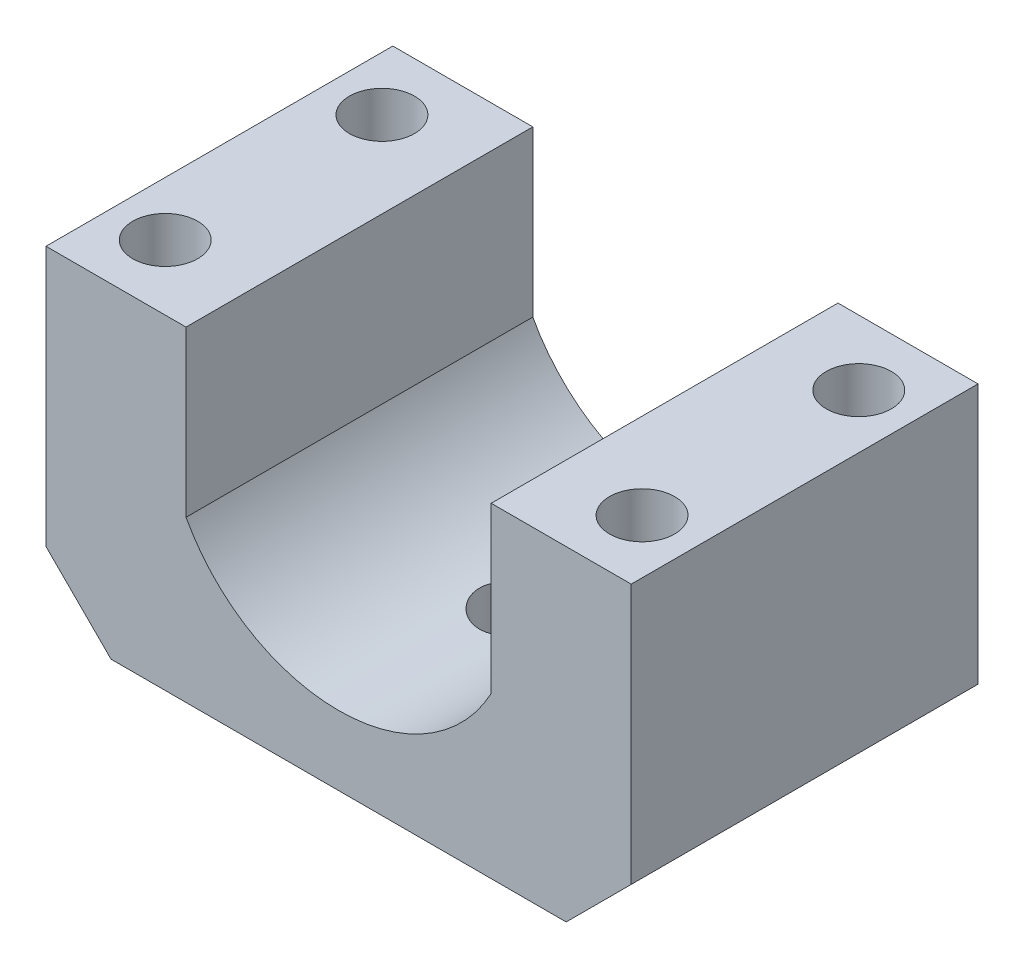
ISO-10303-21;
HEADER;
FILE_DESCRIPTION(('STEP AP214'),'2;1');
FILE_NAME('part.step','',(''),(''),'','','');
FILE_SCHEMA(('AUTOMOTIVE_DESIGN { 1 0 10303 214 1 1 1 1 }'));
ENDSEC;
DATA;
#1=APPLICATION_CONTEXT('core data for automotive mechanical design processes');
#2=APPLICATION_PROTOCOL_DEFINITION('international standard','automotive_design',2000,#1);
#3=PRODUCT_CONTEXT('',#1,'mechanical');
#4=PRODUCT('Part','Part','',(#3));
#5=PRODUCT_RELATED_PRODUCT_CATEGORY('part','',(#4));
#6=PRODUCT_DEFINITION_FORMATION('','',#4);
#7=PRODUCT_DEFINITION_CONTEXT('part definition',#1,'design');
#8=PRODUCT_DEFINITION('design','',#6,#7);
#9=PRODUCT_DEFINITION_SHAPE('','',#8);
#10=(LENGTH_UNIT() NAMED_UNIT(*) SI_UNIT(.MILLI.,.METRE.));
#11=(NAMED_UNIT(*) PLANE_ANGLE_UNIT() SI_UNIT($,.RADIAN.));
#12=(NAMED_UNIT(*) SI_UNIT($,.STERADIAN.) SOLID_ANGLE_UNIT());
#13=UNCERTAINTY_MEASURE_WITH_UNIT(LENGTH_MEASURE(1.E-05),#10,'distance_accuracy_value','');
#14=(GEOMETRIC_REPRESENTATION_CONTEXT(3) GLOBAL_UNCERTAINTY_ASSIGNED_CONTEXT((#13)) GLOBAL_UNIT_ASSIGNED_CONTEXT((#10,
#11,#12)) REPRESENTATION_CONTEXT('',''));
#15=CARTESIAN_POINT('',(0.,0.,0.));
#16=DIRECTION('',(0.,0.,1.));
#17=DIRECTION('',(1.,0.,0.));
#18=AXIS2_PLACEMENT_3D('',#15,#16,#17);
#19=CARTESIAN_POINT('',(0.,0.,16.));
#20=DIRECTION('',(0.,0.,-1.));
#21=DIRECTION('',(-1.,0.,0.));
#22=AXIS2_PLACEMENT_3D('',#19,#20,#21);
#23=CYLINDRICAL_SURFACE('',#22,8.);
#24=DIRECTION('',(0.,0.,-1.));
#25=VECTOR('',#24,1.);
#26=CARTESIAN_POINT('',(-7.03988636271922,-3.8,16.));
#27=LINE('',#26,#25);
#28=CARTESIAN_POINT('',(-7.03988636271922,-3.8,16.));
#29=VERTEX_POINT('',#28);
#30=CARTESIAN_POINT('',(-7.03988636271922,-3.8,0.));
#31=VERTEX_POINT('',#30);
#32=EDGE_CURVE('E118',#29,#31,#27,.T.);
#33=ORIENTED_EDGE('',*,*,#32,.F.);
#34=CARTESIAN_POINT('',(0.,0.,16.));
#35=DIRECTION('',(0.,0.,-1.));
#36=DIRECTION('',(-1.,0.,0.));
#37=AXIS2_PLACEMENT_3D('',#34,#35,#36);
#38=CIRCLE('',#37,8.);
#39=CARTESIAN_POINT('',(7.03988636271922,-3.8,16.));
#40=VERTEX_POINT('',#39);
#41=EDGE_CURVE('E148',#40,#29,#38,.T.);
#42=ORIENTED_EDGE('',*,*,#41,.F.);
#43=DIRECTION('',(0.,0.,-1.));
#44=VECTOR('',#43,1.);
#45=CARTESIAN_POINT('',(7.03988636271922,-3.8,16.));
#46=LINE('',#45,#44);
#47=CARTESIAN_POINT('',(7.03988636271922,-3.8,0.));
#48=VERTEX_POINT('',#47);
#49=EDGE_CURVE('E80',#40,#48,#46,.T.);
#50=ORIENTED_EDGE('',*,*,#49,.T.);
#51=CARTESIAN_POINT('',(0.,0.,0.));
#52=DIRECTION('',(0.,0.,-1.));
#53=DIRECTION('',(-1.,0.,0.));
#54=AXIS2_PLACEMENT_3D('',#51,#52,#53);
#55=CIRCLE('',#54,8.);
#56=EDGE_CURVE('E127',#48,#31,#55,.T.);
#57=ORIENTED_EDGE('',*,*,#56,.T.);
#58=EDGE_LOOP('',(#33,#42,#50,#57));
#59=FACE_BOUND('',#58,.T.);
#60=CARTESIAN_POINT('',(0.,-8.,6.5));
#61=CARTESIAN_POINT('',(0.0833868537930099,-7.99999819477373,6.50000393821342));
#62=CARTESIAN_POINT('',(0.166878352185804,-7.99868157582362,6.50698311729056));
#63=CARTESIAN_POINT('',(0.331573874094402,-7.993552335781,6.5347157734866));
#64=CARTESIAN_POINT('',(0.412772985279594,-7.98973472470621,6.55549678919107));
#65=CARTESIAN_POINT('',(0.570380918902888,-7.98003072170383,6.61017640810877));
#66=CARTESIAN_POINT('',(0.646796039965722,-7.9741471203648,6.6440573231462));
#67=CARTESIAN_POINT('',(0.79282725037137,-7.96095516283942,6.72393113039572));
#68=CARTESIAN_POINT('',(0.86244568924562,-7.95364730163886,6.7699198166283));
#69=CARTESIAN_POINT('',(0.99378177334355,-7.93831356691209,6.87329839444127));
#70=CARTESIAN_POINT('',(1.05540565080139,-7.93028077226027,6.93080640769828));
#71=CARTESIAN_POINT('',(1.16819341503162,-7.91445359605847,7.05533977569488));
#72=CARTESIAN_POINT('',(1.21935599974279,-7.90665924428876,7.12236631339722));
#73=CARTESIAN_POINT('',(1.3101501698913,-7.89212548078817,7.26468639693758));
#74=CARTESIAN_POINT('',(1.34968755533201,-7.88539488113185,7.34004101763045));
#75=CARTESIAN_POINT('',(1.41550547234587,-7.873847090732,7.49646960983975));
#76=CARTESIAN_POINT('',(1.44178726041775,-7.86902971864274,7.57754303843936));
#77=CARTESIAN_POINT('',(1.48005051894972,-7.86192269859203,7.74211516557808));
#78=CARTESIAN_POINT('',(1.49219388286487,-7.85960445732956,7.82557496436828));
#79=CARTESIAN_POINT('',(1.50233808388958,-7.85767197097443,7.99337725104135));
#80=CARTESIAN_POINT('',(1.50034016686744,-7.85805748767657,8.07771966051116));
#81=CARTESIAN_POINT('',(1.48238983259424,-7.86146292034107,8.24371920167856));
#82=CARTESIAN_POINT('',(1.4666216298026,-7.86444805794284,8.32539707226822));
#83=CARTESIAN_POINT('',(1.42186821628764,-7.87266179166918,8.48492780648444));
#84=CARTESIAN_POINT('',(1.39288234029825,-7.87789050071542,8.56278047736423));
#85=CARTESIAN_POINT('',(1.32233516521821,-7.89003878202028,8.71299150636864));
#86=CARTESIAN_POINT('',(1.28069908838472,-7.89696836031569,8.78531390199751));
#87=CARTESIAN_POINT('',(1.18608961629417,-7.91173030510972,8.92200958420064));
#88=CARTESIAN_POINT('',(1.1331159203364,-7.91956269555053,8.98638265986856));
#89=CARTESIAN_POINT('',(1.01635208508941,-7.93539829134603,9.10641187448002));
#90=CARTESIAN_POINT('',(0.952406289044373,-7.94340225682906,9.16191658346096));
#91=CARTESIAN_POINT('',(0.815998209498492,-7.95857075037328,9.26145823877834));
#92=CARTESIAN_POINT('',(0.743532180140778,-7.96573490643359,9.30549011360342));
#93=CARTESIAN_POINT('',(0.591963187313074,-7.97843180568726,9.38085539100454));
#94=CARTESIAN_POINT('',(0.512847006138679,-7.98396119623876,9.41216274620421));
#95=CARTESIAN_POINT('',(0.350454372941183,-7.99273154230783,9.46093850773641));
#96=CARTESIAN_POINT('',(0.267187064116381,-7.99597730825371,9.47843601388517));
#97=CARTESIAN_POINT('',(0.152748431645325,-7.99859995806791,9.49251759126554));
#98=CARTESIAN_POINT('',(0.122272622321126,-7.99912381977634,9.49532114545617));
#99=CARTESIAN_POINT('',(0.0612025752280015,-7.99982417226057,9.49906307369213));
#100=CARTESIAN_POINT('',(0.0306083373219764,-8.00000066263412,9.50000144557756));
#101=CARTESIAN_POINT('',(-0.0833868537930071,-7.99999819477373,9.49999606178658));
#102=CARTESIAN_POINT('',(-0.166878352185801,-7.99868157582362,9.49301688270944));
#103=CARTESIAN_POINT('',(-0.331573874094399,-7.993552335781,9.4652842265134));
#104=CARTESIAN_POINT('',(-0.412772985279592,-7.98973472470621,9.44450321080893));
#105=CARTESIAN_POINT('',(-0.570380918902886,-7.98003072170383,9.38982359189123));
#106=CARTESIAN_POINT('',(-0.646796039965719,-7.9741471203648,9.3559426768538));
#107=CARTESIAN_POINT('',(-0.792827250371368,-7.96095516283942,9.27606886960428));
#108=CARTESIAN_POINT('',(-0.862445689245618,-7.95364730163886,9.2300801833717));
#109=CARTESIAN_POINT('',(-0.993781773343547,-7.93831356691209,9.12670160555873));
#110=CARTESIAN_POINT('',(-1.05540565080139,-7.93028077226027,9.06919359230172));
#111=CARTESIAN_POINT('',(-1.16819341503162,-7.91445359605848,8.94466022430512));
#112=CARTESIAN_POINT('',(-1.21935599974279,-7.90665924428876,8.87763368660278));
#113=CARTESIAN_POINT('',(-1.3101501698913,-7.89212548078817,8.73531360306242));
#114=CARTESIAN_POINT('',(-1.34968755533201,-7.88539488113186,8.65995898236955));
#115=CARTESIAN_POINT('',(-1.41550547234587,-7.87384709073201,8.50353039016025));
#116=CARTESIAN_POINT('',(-1.44178726041775,-7.86902971864274,8.42245696156064));
#117=CARTESIAN_POINT('',(-1.48005051894971,-7.86192269859203,8.25788483442192));
#118=CARTESIAN_POINT('',(-1.49219388286486,-7.85960445732956,8.17442503563172));
#119=CARTESIAN_POINT('',(-1.50233808388958,-7.85767197097443,8.00662274895865));
#120=CARTESIAN_POINT('',(-1.50034016686743,-7.85805748767657,7.92228033948884));
#121=CARTESIAN_POINT('',(-1.48238983259424,-7.86146292034107,7.75628079832144));
#122=CARTESIAN_POINT('',(-1.4666216298026,-7.86444805794284,7.67460292773178));
#123=CARTESIAN_POINT('',(-1.42186821628764,-7.87266179166918,7.51507219351557));
#124=CARTESIAN_POINT('',(-1.39288234029825,-7.87789050071542,7.43721952263578));
#125=CARTESIAN_POINT('',(-1.32233516521821,-7.89003878202028,7.28700849363136));
#126=CARTESIAN_POINT('',(-1.28069908838472,-7.89696836031569,7.21468609800249));
#127=CARTESIAN_POINT('',(-1.18608961629416,-7.91173030510972,7.07799041579936));
#128=CARTESIAN_POINT('',(-1.1331159203364,-7.91956269555054,7.01361734013144));
#129=CARTESIAN_POINT('',(-1.01635208508941,-7.93539829134603,6.89358812551998));
#130=CARTESIAN_POINT('',(-0.95240628904437,-7.94340225682906,6.83808341653904));
#131=CARTESIAN_POINT('',(-0.81599820949849,-7.95857075037328,6.73854176122166));
#132=CARTESIAN_POINT('',(-0.743532180140776,-7.96573490643359,6.69450988639658));
#133=CARTESIAN_POINT('',(-0.591963187313073,-7.97843180568726,6.61914460899547));
#134=CARTESIAN_POINT('',(-0.512847006138678,-7.98396119623876,6.58783725379579));
#135=CARTESIAN_POINT('',(-0.350454372941182,-7.99273154230783,6.53906149226359));
#136=CARTESIAN_POINT('',(-0.26718706411638,-7.99597730825371,6.52156398611483));
#137=CARTESIAN_POINT('',(-0.152748431645324,-7.99859995806791,6.50748240873446));
#138=CARTESIAN_POINT('',(-0.122272622321125,-7.99912381977634,6.50467885454384));
#139=CARTESIAN_POINT('',(-0.0612025752280001,-7.99982417226057,6.50093692630787));
#140=CARTESIAN_POINT('',(-0.0306083373219742,-8.00000066263412,6.49999855442244));
#141=CARTESIAN_POINT('',(0.,-8.,6.5));
#142=B_SPLINE_CURVE_WITH_KNOTS('',3,(#60,#61,#62,#63,#64,#65,#66,#67,#68,#69,#70,#71,#72,#73,
#74,#75,#76,#77,#78,#79,#80,#81,#82,#83,#84,#85,#86,#87,#88,#89,#90,#91,#92,#93,#94,#95,#96,#97,
#98,#99,#100,#101,#102,#103,#104,#105,#106,#107,#108,#109,#110,#111,#112,#113,#114,#115,#116,
#117,#118,#119,#120,#121,#122,#123,#124,#125,#126,#127,#128,#129,#130,#131,#132,#133,#134,#135,
#136,#137,#138,#139,#140,#141),.UNSPECIFIED.,.T.,.F.,(4,2,2,2,2,2,2,2,2,2,2,2,2,2,2,2,2,2,2,2,2,
2,2,2,2,2,2,2,2,2,2,2,2,2,2,2,2,2,2,2,4),(0.,0.250043615860785,0.500587644663305,
0.750794550490422,1.00091465423448,1.25374453431369,1.50660586364784,1.76146299504457,
2.0162959639786,2.26818131595642,2.52004447672905,2.76858903253727,3.01714609936091,
3.26720200380497,3.51726454115,3.77122292222619,4.02529337465931,4.27988132685465,
4.53393137376114,4.62571335291781,4.71749543835866,4.96753905421944,5.21808308302196,
5.46828998884908,5.71841009259314,5.97123997267235,6.22410130200649,6.47895843340322,
6.73379140233725,6.98567675431508,7.23753991508771,7.48608447089592,7.73464153771956,
7.98469744216363,8.23475997950866,8.48871836058484,8.74278881301796,8.9973767652133,
9.2514268121198,9.34320879127646,9.43499087671731),.UNSPECIFIED.);
#143=CARTESIAN_POINT('',(0.,-8.,6.5));
#144=VERTEX_POINT('',#143);
#145=EDGE_CURVE('E21',#144,#144,#142,.T.);
#146=ORIENTED_EDGE('',*,*,#145,.T.);
#147=EDGE_LOOP('',(#146));
#148=FACE_BOUND('',#147,.T.);
#149=ADVANCED_FACE('F17',(#59,#148),#23,.F.);
#150=CARTESIAN_POINT('',(-7.03988636271922,0.,16.));
#151=DIRECTION('',(1.,0.,0.));
#152=DIRECTION('',(0.,0.,-1.));
#153=AXIS2_PLACEMENT_3D('',#150,#151,#152);
#154=PLANE('',#153);
#155=DIRECTION('',(0.,1.,0.));
#156=VECTOR('',#155,1.);
#157=CARTESIAN_POINT('',(-7.03988636271922,0.,16.));
#158=LINE('',#157,#156);
#159=CARTESIAN_POINT('',(-7.03988636271922,3.8,16.));
#160=VERTEX_POINT('',#159);
#161=EDGE_CURVE('E123',#29,#160,#158,.T.);
#162=ORIENTED_EDGE('',*,*,#161,.F.);
#163=ORIENTED_EDGE('',*,*,#32,.T.);
#164=DIRECTION('',(0.,1.,0.));
#165=VECTOR('',#164,1.);
#166=CARTESIAN_POINT('',(-7.03988636271922,0.,0.));
#167=LINE('',#166,#165);
#168=CARTESIAN_POINT('',(-7.03988636271922,3.8,0.));
#169=VERTEX_POINT('',#168);
#170=EDGE_CURVE('E121',#31,#169,#167,.T.);
#171=ORIENTED_EDGE('',*,*,#170,.T.);
#172=DIRECTION('',(0.,0.,1.));
#173=VECTOR('',#172,1.);
#174=CARTESIAN_POINT('',(-7.03988636271922,3.8,16.));
#175=LINE('',#174,#173);
#176=EDGE_CURVE('E111',#160,#169,#175,.F.);
#177=ORIENTED_EDGE('',*,*,#176,.F.);
#178=EDGE_LOOP('',(#162,#163,#171,#177));
#179=FACE_BOUND('',#178,.T.);
#180=ADVANCED_FACE('F120',(#179),#154,.T.);
#181=CARTESIAN_POINT('',(0.,3.8,16.));
#182=DIRECTION('',(0.,1.,0.));
#183=DIRECTION('',(0.,0.,1.));
#184=AXIS2_PLACEMENT_3D('',#181,#182,#183);
#185=PLANE('',#184);
#186=DIRECTION('',(1.,0.,0.));
#187=VECTOR('',#186,1.);
#188=CARTESIAN_POINT('',(0.,3.8,16.));
#189=LINE('',#188,#187);
#190=CARTESIAN_POINT('',(-13.5,3.8,16.));
#191=VERTEX_POINT('',#190);
#192=EDGE_CURVE('E198',#160,#191,#189,.F.);
#193=ORIENTED_EDGE('',*,*,#192,.F.);
#194=ORIENTED_EDGE('',*,*,#176,.T.);
#195=DIRECTION('',(1.,0.,0.));
#196=VECTOR('',#195,1.);
#197=CARTESIAN_POINT('',(0.,3.8,0.));
#198=LINE('',#197,#196);
#199=CARTESIAN_POINT('',(-13.5,3.8,0.));
#200=VERTEX_POINT('',#199);
#201=EDGE_CURVE('E129',#169,#200,#198,.F.);
#202=ORIENTED_EDGE('',*,*,#201,.T.);
#203=DIRECTION('',(0.,0.,1.));
#204=VECTOR('',#203,1.);
#205=CARTESIAN_POINT('',(-13.5,3.8,16.));
#206=LINE('',#205,#204);
#207=EDGE_CURVE('E195',#191,#200,#206,.F.);
#208=ORIENTED_EDGE('',*,*,#207,.F.);
#209=EDGE_LOOP('',(#193,#194,#202,#208));
#210=FACE_BOUND('',#209,.T.);
#211=CARTESIAN_POINT('',(-11.,3.8,3.));
#212=DIRECTION('',(0.,1.,0.));
#213=DIRECTION('',(0.,0.,1.));
#214=AXIS2_PLACEMENT_3D('',#211,#212,#213);
#215=CIRCLE('',#214,1.5);
#216=CARTESIAN_POINT('',(-11.,3.8,4.5));
#217=VERTEX_POINT('',#216);
#218=EDGE_CURVE('E132',#217,#217,#215,.F.);
#219=ORIENTED_EDGE('',*,*,#218,.T.);
#220=EDGE_LOOP('',(#219));
#221=FACE_BOUND('',#220,.T.);
#222=CARTESIAN_POINT('',(-11.,3.8,13.));
#223=DIRECTION('',(0.,1.,0.));
#224=DIRECTION('',(0.,0.,1.));
#225=AXIS2_PLACEMENT_3D('',#222,#223,#224);
#226=CIRCLE('',#225,1.5);
#227=CARTESIAN_POINT('',(-11.,3.8,14.5));
#228=VERTEX_POINT('',#227);
#229=EDGE_CURVE('E142',#228,#228,#226,.F.);
#230=ORIENTED_EDGE('',*,*,#229,.T.);
#231=EDGE_LOOP('',(#230));
#232=FACE_BOUND('',#231,.T.);
#233=ADVANCED_FACE('F354',(#210,#221,#232),#185,.T.);
#234=CARTESIAN_POINT('',(-13.5,0.,16.));
#235=DIRECTION('',(-1.,0.,0.));
#236=DIRECTION('',(0.,0.,1.));
#237=AXIS2_PLACEMENT_3D('',#234,#235,#236);
#238=PLANE('',#237);
#239=DIRECTION('',(0.,1.,0.));
#240=VECTOR('',#239,1.);
#241=CARTESIAN_POINT('',(-13.5,0.,16.));
#242=LINE('',#241,#240);
#243=CARTESIAN_POINT('',(-13.5,-8.2,16.));
#244=VERTEX_POINT('',#243);
#245=EDGE_CURVE('E200',#191,#244,#242,.F.);
#246=ORIENTED_EDGE('',*,*,#245,.F.);
#247=ORIENTED_EDGE('',*,*,#207,.T.);
#248=DIRECTION('',(0.,1.,0.));
#249=VECTOR('',#248,1.);
#250=CARTESIAN_POINT('',(-13.5,0.,0.));
#251=LINE('',#250,#249);
#252=CARTESIAN_POINT('',(-13.5,-8.2,0.));
#253=VERTEX_POINT('',#252);
#254=EDGE_CURVE('E182',#200,#253,#251,.F.);
#255=ORIENTED_EDGE('',*,*,#254,.T.);
#256=DIRECTION('',(0.,0.,1.));
#257=VECTOR('',#256,1.);
#258=CARTESIAN_POINT('',(-13.5,-8.2,16.));
#259=LINE('',#258,#257);
#260=EDGE_CURVE('E211',#244,#253,#259,.F.);
#261=ORIENTED_EDGE('',*,*,#260,.F.);
#262=EDGE_LOOP('',(#246,#247,#255,#261));
#263=FACE_BOUND('',#262,.T.);
#264=ADVANCED_FACE('F351',(#263),#238,.T.);
#265=CARTESIAN_POINT('',(7.03988636271922,0.,16.));
#266=DIRECTION('',(1.,0.,0.));
#267=DIRECTION('',(0.,0.,-1.));
#268=AXIS2_PLACEMENT_3D('',#265,#266,#267);
#269=PLANE('',#268);
#270=ORIENTED_EDGE('',*,*,#49,.F.);
#271=DIRECTION('',(0.,1.,0.));
#272=VECTOR('',#271,1.);
#273=CARTESIAN_POINT('',(7.03988636271922,0.,16.));
#274=LINE('',#273,#272);
#275=CARTESIAN_POINT('',(7.03988636271922,3.8,16.));
#276=VERTEX_POINT('',#275);
#277=EDGE_CURVE('E154',#276,#40,#274,.F.);
#278=ORIENTED_EDGE('',*,*,#277,.F.);
#279=DIRECTION('',(0.,0.,1.));
#280=VECTOR('',#279,1.);
#281=CARTESIAN_POINT('',(7.03988636271922,3.8,16.));
#282=LINE('',#281,#280);
#283=CARTESIAN_POINT('',(7.03988636271922,3.8,0.));
#284=VERTEX_POINT('',#283);
#285=EDGE_CURVE('E91',#284,#276,#282,.T.);
#286=ORIENTED_EDGE('',*,*,#285,.F.);
#287=DIRECTION('',(0.,1.,0.));
#288=VECTOR('',#287,1.);
#289=CARTESIAN_POINT('',(7.03988636271922,0.,0.));
#290=LINE('',#289,#288);
#291=EDGE_CURVE('E133',#284,#48,#290,.F.);
#292=ORIENTED_EDGE('',*,*,#291,.T.);
#293=EDGE_LOOP('',(#270,#278,#286,#292));
#294=FACE_BOUND('',#293,.T.);
#295=ADVANCED_FACE('F341',(#294),#269,.F.);
#296=CARTESIAN_POINT('',(13.5,0.,16.));
#297=DIRECTION('',(-1.,0.,0.));
#298=DIRECTION('',(0.,0.,1.));
#299=AXIS2_PLACEMENT_3D('',#296,#297,#298);
#300=PLANE('',#299);
#301=DIRECTION('',(0.,0.,1.));
#302=VECTOR('',#301,1.);
#303=CARTESIAN_POINT('',(13.5,3.8,16.));
#304=LINE('',#303,#302);
#305=CARTESIAN_POINT('',(13.5,3.8,16.));
#306=VERTEX_POINT('',#305);
#307=CARTESIAN_POINT('',(13.5,3.8,0.));
#308=VERTEX_POINT('',#307);
#309=EDGE_CURVE('E215',#306,#308,#304,.F.);
#310=ORIENTED_EDGE('',*,*,#309,.F.);
#311=DIRECTION('',(0.,1.,0.));
#312=VECTOR('',#311,1.);
#313=CARTESIAN_POINT('',(13.5,0.,16.));
#314=LINE('',#313,#312);
#315=CARTESIAN_POINT('',(13.5,-8.2,16.));
#316=VERTEX_POINT('',#315);
#317=EDGE_CURVE('E225',#316,#306,#314,.T.);
#318=ORIENTED_EDGE('',*,*,#317,.F.);
#319=DIRECTION('',(0.,0.,1.));
#320=VECTOR('',#319,1.);
#321=CARTESIAN_POINT('',(13.5,-8.2,16.));
#322=LINE('',#321,#320);
#323=CARTESIAN_POINT('',(13.5,-8.2,0.));
#324=VERTEX_POINT('',#323);
#325=EDGE_CURVE('E233',#316,#324,#322,.F.);
#326=ORIENTED_EDGE('',*,*,#325,.T.);
#327=DIRECTION('',(0.,1.,0.));
#328=VECTOR('',#327,1.);
#329=CARTESIAN_POINT('',(13.5,0.,0.));
#330=LINE('',#329,#328);
#331=EDGE_CURVE('E187',#324,#308,#330,.T.);
#332=ORIENTED_EDGE('',*,*,#331,.T.);
#333=EDGE_LOOP('',(#310,#318,#326,#332));
#334=FACE_BOUND('',#333,.T.);
#335=ADVANCED_FACE('F333',(#334),#300,.F.);
#336=CARTESIAN_POINT('',(0.,3.8,16.));
#337=DIRECTION('',(0.,1.,0.));
#338=DIRECTION('',(0.,0.,1.));
#339=AXIS2_PLACEMENT_3D('',#336,#337,#338);
#340=PLANE('',#339);
#341=DIRECTION('',(1.,0.,0.));
#342=VECTOR('',#341,1.);
#343=CARTESIAN_POINT('',(0.,3.8,16.));
#344=LINE('',#343,#342);
#345=EDGE_CURVE('E222',#306,#276,#344,.F.);
#346=ORIENTED_EDGE('',*,*,#345,.F.);
#347=ORIENTED_EDGE('',*,*,#309,.T.);
#348=DIRECTION('',(1.,0.,0.));
#349=VECTOR('',#348,1.);
#350=CARTESIAN_POINT('',(0.,3.8,0.));
#351=LINE('',#350,#349);
#352=EDGE_CURVE('E137',#308,#284,#351,.F.);
#353=ORIENTED_EDGE('',*,*,#352,.T.);
#354=ORIENTED_EDGE('',*,*,#285,.T.);
#355=EDGE_LOOP('',(#346,#347,#353,#354));
#356=FACE_BOUND('',#355,.T.);
#357=CARTESIAN_POINT('',(11.,3.8,13.));
#358=DIRECTION('',(0.,1.,0.));
#359=DIRECTION('',(0.,0.,1.));
#360=AXIS2_PLACEMENT_3D('',#357,#358,#359);
#361=CIRCLE('',#360,1.5);
#362=CARTESIAN_POINT('',(11.,3.8,14.5));
#363=VERTEX_POINT('',#362);
#364=EDGE_CURVE('E150',#363,#363,#361,.F.);
#365=ORIENTED_EDGE('',*,*,#364,.T.);
#366=EDGE_LOOP('',(#365));
#367=FACE_BOUND('',#366,.T.);
#368=CARTESIAN_POINT('',(11.,3.8,3.));
#369=DIRECTION('',(0.,1.,0.));
#370=DIRECTION('',(0.,0.,1.));
#371=AXIS2_PLACEMENT_3D('',#368,#369,#370);
#372=CIRCLE('',#371,1.5);
#373=CARTESIAN_POINT('',(11.,3.8,4.5));
#374=VERTEX_POINT('',#373);
#375=EDGE_CURVE('E157',#374,#374,#372,.F.);
#376=ORIENTED_EDGE('',*,*,#375,.T.);
#377=EDGE_LOOP('',(#376));
#378=FACE_BOUND('',#377,.T.);
#379=ADVANCED_FACE('F330',(#356,#367,#378),#340,.T.);
#380=CARTESIAN_POINT('',(0.,-11.2,8.));
#381=DIRECTION('',(0.,1.,0.));
#382=DIRECTION('',(0.,0.,1.));
#383=AXIS2_PLACEMENT_3D('',#380,#381,#382);
#384=CYLINDRICAL_SURFACE('',#383,1.5);
#385=CARTESIAN_POINT('',(0.,-11.2,8.));
#386=DIRECTION('',(0.,1.,0.));
#387=DIRECTION('',(0.,0.,1.));
#388=AXIS2_PLACEMENT_3D('',#385,#386,#387);
#389=CIRCLE('',#388,1.5);
#390=CARTESIAN_POINT('',(0.,-11.2,9.5));
#391=VERTEX_POINT('',#390);
#392=EDGE_CURVE('E162',#391,#391,#389,.F.);
#393=ORIENTED_EDGE('',*,*,#392,.T.);
#394=EDGE_LOOP('',(#393));
#395=FACE_BOUND('',#394,.T.);
#396=ORIENTED_EDGE('',*,*,#145,.F.);
#397=EDGE_LOOP('',(#396));
#398=FACE_BOUND('',#397,.T.);
#399=ADVANCED_FACE('F332',(#395,#398),#384,.F.);
#400=CARTESIAN_POINT('',(0.,0.,0.));
#401=DIRECTION('',(0.,0.,1.));
#402=DIRECTION('',(1.,0.,0.));
#403=AXIS2_PLACEMENT_3D('',#400,#401,#402);
#404=PLANE('',#403);
#405=ORIENTED_EDGE('',*,*,#291,.F.);
#406=ORIENTED_EDGE('',*,*,#352,.F.);
#407=ORIENTED_EDGE('',*,*,#331,.F.);
#408=DIRECTION('',(-0.707106781186547,-0.707106781186548,0.));
#409=VECTOR('',#408,1.);
#410=CARTESIAN_POINT('',(10.85,-10.85,0.));
#411=LINE('',#410,#409);
#412=CARTESIAN_POINT('',(10.5,-11.2,0.));
#413=VERTEX_POINT('',#412);
#414=EDGE_CURVE('E236',#324,#413,#411,.T.);
#415=ORIENTED_EDGE('',*,*,#414,.T.);
#416=DIRECTION('',(1.,0.,0.));
#417=VECTOR('',#416,1.);
#418=CARTESIAN_POINT('',(0.,-11.2,0.));
#419=LINE('',#418,#417);
#420=CARTESIAN_POINT('',(-10.5,-11.2,0.));
#421=VERTEX_POINT('',#420);
#422=EDGE_CURVE('E165',#413,#421,#419,.F.);
#423=ORIENTED_EDGE('',*,*,#422,.T.);
#424=DIRECTION('',(0.707106781186547,-0.707106781186548,0.));
#425=VECTOR('',#424,1.);
#426=CARTESIAN_POINT('',(-10.85,-10.85,0.));
#427=LINE('',#426,#425);
#428=EDGE_CURVE('E143',#253,#421,#427,.T.);
#429=ORIENTED_EDGE('',*,*,#428,.F.);
#430=ORIENTED_EDGE('',*,*,#254,.F.);
#431=ORIENTED_EDGE('',*,*,#201,.F.);
#432=ORIENTED_EDGE('',*,*,#170,.F.);
#433=ORIENTED_EDGE('',*,*,#56,.F.);
#434=EDGE_LOOP('',(#405,#406,#407,#415,#423,#429,#430,#431,#432,#433));
#435=FACE_BOUND('',#434,.T.);
#436=ADVANCED_FACE('F126',(#435),#404,.F.);
#437=CARTESIAN_POINT('',(-11.,-11.2,3.));
#438=DIRECTION('',(0.,1.,0.));
#439=DIRECTION('',(0.,0.,1.));
#440=AXIS2_PLACEMENT_3D('',#437,#438,#439);
#441=CYLINDRICAL_SURFACE('',#440,1.5);
#442=CARTESIAN_POINT('',(-11.,-10.7,3.));
#443=DIRECTION('',(-0.707106781186548,-0.707106781186547,0.));
#444=DIRECTION('',(-0.707106781186547,0.707106781186548,0.));
#445=AXIS2_PLACEMENT_3D('',#442,#443,#444);
#446=ELLIPSE('',#445,2.12132034355964,1.5);
#447=CARTESIAN_POINT('',(-10.5,-11.2,1.58578643762691));
#448=VERTEX_POINT('',#447);
#449=CARTESIAN_POINT('',(-10.5,-11.2,4.41421356237309));
#450=VERTEX_POINT('',#449);
#451=EDGE_CURVE('E140',#448,#450,#446,.F.);
#452=ORIENTED_EDGE('',*,*,#451,.F.);
#453=CARTESIAN_POINT('',(-11.,-11.2,3.));
#454=DIRECTION('',(0.,1.,0.));
#455=DIRECTION('',(0.,0.,1.));
#456=AXIS2_PLACEMENT_3D('',#453,#454,#455);
#457=CIRCLE('',#456,1.5);
#458=EDGE_CURVE('E166',#448,#450,#457,.F.);
#459=ORIENTED_EDGE('',*,*,#458,.T.);
#460=EDGE_LOOP('',(#452,#459));
#461=FACE_BOUND('',#460,.T.);
#462=ORIENTED_EDGE('',*,*,#218,.F.);
#463=EDGE_LOOP('',(#462));
#464=FACE_BOUND('',#463,.T.);
#465=ADVANCED_FACE('F415',(#461,#464),#441,.F.);
#466=CARTESIAN_POINT('',(-10.85,-10.85,16.));
#467=DIRECTION('',(-0.707106781186548,-0.707106781186547,0.));
#468=DIRECTION('',(0.707106781186547,-0.707106781186548,0.));
#469=AXIS2_PLACEMENT_3D('',#466,#467,#468);
#470=PLANE('',#469);
#471=CARTESIAN_POINT('',(-11.,-10.7,13.));
#472=DIRECTION('',(-0.707106781186548,-0.707106781186547,0.));
#473=DIRECTION('',(-0.707106781186547,0.707106781186548,0.));
#474=AXIS2_PLACEMENT_3D('',#471,#472,#473);
#475=ELLIPSE('',#474,2.12132034355964,1.5);
#476=CARTESIAN_POINT('',(-10.5,-11.2,11.5857864376269));
#477=VERTEX_POINT('',#476);
#478=CARTESIAN_POINT('',(-10.5,-11.2,14.4142135623731));
#479=VERTEX_POINT('',#478);
#480=EDGE_CURVE('E146',#477,#479,#475,.F.);
#481=ORIENTED_EDGE('',*,*,#480,.T.);
#482=DIRECTION('',(0.,0.,1.));
#483=VECTOR('',#482,1.);
#484=CARTESIAN_POINT('',(-10.5,-11.2,16.));
#485=LINE('',#484,#483);
#486=CARTESIAN_POINT('',(-10.5,-11.2,16.));
#487=VERTEX_POINT('',#486);
#488=EDGE_CURVE('E135',#479,#487,#485,.T.);
#489=ORIENTED_EDGE('',*,*,#488,.T.);
#490=DIRECTION('',(0.707106781186547,-0.707106781186548,0.));
#491=VECTOR('',#490,1.);
#492=CARTESIAN_POINT('',(-13.5,-8.2,16.));
#493=LINE('',#492,#491);
#494=EDGE_CURVE('E208',#244,#487,#493,.T.);
#495=ORIENTED_EDGE('',*,*,#494,.F.);
#496=ORIENTED_EDGE('',*,*,#260,.T.);
#497=ORIENTED_EDGE('',*,*,#428,.T.);
#498=DIRECTION('',(0.,0.,1.));
#499=VECTOR('',#498,1.);
#500=CARTESIAN_POINT('',(-10.5,-11.2,16.));
#501=LINE('',#500,#499);
#502=EDGE_CURVE('E170',#421,#448,#501,.T.);
#503=ORIENTED_EDGE('',*,*,#502,.T.);
#504=ORIENTED_EDGE('',*,*,#451,.T.);
#505=DIRECTION('',(0.,0.,1.));
#506=VECTOR('',#505,1.);
#507=CARTESIAN_POINT('',(-10.5,-11.2,16.));
#508=LINE('',#507,#506);
#509=EDGE_CURVE('E169',#450,#477,#508,.T.);
#510=ORIENTED_EDGE('',*,*,#509,.T.);
#511=EDGE_LOOP('',(#481,#489,#495,#496,#497,#503,#504,#510));
#512=FACE_BOUND('',#511,.T.);
#513=ADVANCED_FACE('F423',(#512),#470,.T.);
#514=CARTESIAN_POINT('',(-11.,-11.2,13.));
#515=DIRECTION('',(0.,1.,0.));
#516=DIRECTION('',(0.,0.,1.));
#517=AXIS2_PLACEMENT_3D('',#514,#515,#516);
#518=CYLINDRICAL_SURFACE('',#517,1.5);
#519=CARTESIAN_POINT('',(-11.,-11.2,13.));
#520=DIRECTION('',(0.,1.,0.));
#521=DIRECTION('',(0.,0.,1.));
#522=AXIS2_PLACEMENT_3D('',#519,#520,#521);
#523=CIRCLE('',#522,1.5);
#524=EDGE_CURVE('E171',#477,#479,#523,.F.);
#525=ORIENTED_EDGE('',*,*,#524,.T.);
#526=ORIENTED_EDGE('',*,*,#480,.F.);
#527=EDGE_LOOP('',(#525,#526));
#528=FACE_BOUND('',#527,.T.);
#529=ORIENTED_EDGE('',*,*,#229,.F.);
#530=EDGE_LOOP('',(#529));
#531=FACE_BOUND('',#530,.T.);
#532=ADVANCED_FACE('F314',(#528,#531),#518,.F.);
#533=CARTESIAN_POINT('',(0.,0.,16.));
#534=DIRECTION('',(0.,0.,1.));
#535=DIRECTION('',(1.,0.,0.));
#536=AXIS2_PLACEMENT_3D('',#533,#534,#535);
#537=PLANE('',#536);
#538=ORIENTED_EDGE('',*,*,#345,.T.);
#539=ORIENTED_EDGE('',*,*,#277,.T.);
#540=ORIENTED_EDGE('',*,*,#41,.T.);
#541=ORIENTED_EDGE('',*,*,#161,.T.);
#542=ORIENTED_EDGE('',*,*,#192,.T.);
#543=ORIENTED_EDGE('',*,*,#245,.T.);
#544=ORIENTED_EDGE('',*,*,#494,.T.);
#545=DIRECTION('',(1.,0.,0.));
#546=VECTOR('',#545,1.);
#547=CARTESIAN_POINT('',(0.,-11.2,16.));
#548=LINE('',#547,#546);
#549=CARTESIAN_POINT('',(10.5,-11.2,16.));
#550=VERTEX_POINT('',#549);
#551=EDGE_CURVE('E174',#487,#550,#548,.T.);
#552=ORIENTED_EDGE('',*,*,#551,.T.);
#553=DIRECTION('',(-0.707106781186547,-0.707106781186548,0.));
#554=VECTOR('',#553,1.);
#555=CARTESIAN_POINT('',(10.85,-10.85,16.));
#556=LINE('',#555,#554);
#557=EDGE_CURVE('E156',#550,#316,#556,.F.);
#558=ORIENTED_EDGE('',*,*,#557,.T.);
#559=ORIENTED_EDGE('',*,*,#317,.T.);
#560=EDGE_LOOP('',(#538,#539,#540,#541,#542,#543,#544,#552,#558,#559));
#561=FACE_BOUND('',#560,.T.);
#562=ADVANCED_FACE('F304',(#561),#537,.T.);
#563=CARTESIAN_POINT('',(11.,-11.2,13.));
#564=DIRECTION('',(0.,1.,0.));
#565=DIRECTION('',(0.,0.,1.));
#566=AXIS2_PLACEMENT_3D('',#563,#564,#565);
#567=CYLINDRICAL_SURFACE('',#566,1.5);
#568=ORIENTED_EDGE('',*,*,#364,.F.);
#569=EDGE_LOOP('',(#568));
#570=FACE_BOUND('',#569,.T.);
#571=CARTESIAN_POINT('',(11.,-11.2,13.));
#572=DIRECTION('',(0.,1.,0.));
#573=DIRECTION('',(0.,0.,1.));
#574=AXIS2_PLACEMENT_3D('',#571,#572,#573);
#575=CIRCLE('',#574,1.5);
#576=CARTESIAN_POINT('',(10.5,-11.2,14.4142135623731));
#577=VERTEX_POINT('',#576);
#578=CARTESIAN_POINT('',(10.5,-11.2,11.5857864376269));
#579=VERTEX_POINT('',#578);
#580=EDGE_CURVE('E175',#577,#579,#575,.F.);
#581=ORIENTED_EDGE('',*,*,#580,.T.);
#582=CARTESIAN_POINT('',(11.,-10.7,13.));
#583=DIRECTION('',(-0.707106781186548,0.707106781186547,0.));
#584=DIRECTION('',(0.707106781186547,0.707106781186548,0.));
#585=AXIS2_PLACEMENT_3D('',#582,#583,#584);
#586=ELLIPSE('',#585,2.12132034355964,1.5);
#587=EDGE_CURVE('E153',#579,#577,#586,.F.);
#588=ORIENTED_EDGE('',*,*,#587,.T.);
#589=EDGE_LOOP('',(#581,#588));
#590=FACE_BOUND('',#589,.T.);
#591=ADVANCED_FACE('F302',(#570,#590),#567,.F.);
#592=CARTESIAN_POINT('',(10.85,-10.85,16.));
#593=DIRECTION('',(-0.707106781186548,0.707106781186547,0.));
#594=DIRECTION('',(-0.707106781186547,-0.707106781186548,0.));
#595=AXIS2_PLACEMENT_3D('',#592,#593,#594);
#596=PLANE('',#595);
#597=DIRECTION('',(0.,0.,1.));
#598=VECTOR('',#597,1.);
#599=CARTESIAN_POINT('',(10.5,-11.2,16.));
#600=LINE('',#599,#598);
#601=CARTESIAN_POINT('',(10.5,-11.2,4.4142135623731));
#602=VERTEX_POINT('',#601);
#603=EDGE_CURVE('E30',#579,#602,#600,.F.);
#604=ORIENTED_EDGE('',*,*,#603,.T.);
#605=CARTESIAN_POINT('',(11.,-10.7,3.));
#606=DIRECTION('',(-0.707106781186548,0.707106781186547,0.));
#607=DIRECTION('',(0.707106781186547,0.707106781186548,0.));
#608=AXIS2_PLACEMENT_3D('',#605,#606,#607);
#609=ELLIPSE('',#608,2.12132034355964,1.5);
#610=CARTESIAN_POINT('',(10.5,-11.2,1.5857864376269));
#611=VERTEX_POINT('',#610);
#612=EDGE_CURVE('E160',#602,#611,#609,.T.);
#613=ORIENTED_EDGE('',*,*,#612,.T.);
#614=DIRECTION('',(0.,0.,1.));
#615=VECTOR('',#614,1.);
#616=CARTESIAN_POINT('',(10.5,-11.2,16.));
#617=LINE('',#616,#615);
#618=EDGE_CURVE('E39',#413,#611,#617,.T.);
#619=ORIENTED_EDGE('',*,*,#618,.F.);
#620=ORIENTED_EDGE('',*,*,#414,.F.);
#621=ORIENTED_EDGE('',*,*,#325,.F.);
#622=ORIENTED_EDGE('',*,*,#557,.F.);
#623=DIRECTION('',(0.,0.,1.));
#624=VECTOR('',#623,1.);
#625=CARTESIAN_POINT('',(10.5,-11.2,16.));
#626=LINE('',#625,#624);
#627=EDGE_CURVE('E177',#550,#577,#626,.F.);
#628=ORIENTED_EDGE('',*,*,#627,.T.);
#629=ORIENTED_EDGE('',*,*,#587,.F.);
#630=EDGE_LOOP('',(#604,#613,#619,#620,#621,#622,#628,#629));
#631=FACE_BOUND('',#630,.T.);
#632=ADVANCED_FACE('F296',(#631),#596,.F.);
#633=CARTESIAN_POINT('',(11.,-11.2,3.));
#634=DIRECTION('',(0.,1.,0.));
#635=DIRECTION('',(0.,0.,1.));
#636=AXIS2_PLACEMENT_3D('',#633,#634,#635);
#637=CYLINDRICAL_SURFACE('',#636,1.5);
#638=ORIENTED_EDGE('',*,*,#375,.F.);
#639=EDGE_LOOP('',(#638));
#640=FACE_BOUND('',#639,.T.);
#641=ORIENTED_EDGE('',*,*,#612,.F.);
#642=CARTESIAN_POINT('',(11.,-11.2,3.));
#643=DIRECTION('',(0.,1.,0.));
#644=DIRECTION('',(0.,0.,1.));
#645=AXIS2_PLACEMENT_3D('',#642,#643,#644);
#646=CIRCLE('',#645,1.5);
#647=EDGE_CURVE('E11',#602,#611,#646,.F.);
#648=ORIENTED_EDGE('',*,*,#647,.T.);
#649=EDGE_LOOP('',(#641,#648));
#650=FACE_BOUND('',#649,.T.);
#651=ADVANCED_FACE('F312',(#640,#650),#637,.F.);
#652=CARTESIAN_POINT('',(0.,-11.2,16.));
#653=DIRECTION('',(0.,1.,0.));
#654=DIRECTION('',(0.,0.,1.));
#655=AXIS2_PLACEMENT_3D('',#652,#653,#654);
#656=PLANE('',#655);
#657=ORIENTED_EDGE('',*,*,#647,.F.);
#658=ORIENTED_EDGE('',*,*,#603,.F.);
#659=ORIENTED_EDGE('',*,*,#580,.F.);
#660=ORIENTED_EDGE('',*,*,#627,.F.);
#661=ORIENTED_EDGE('',*,*,#551,.F.);
#662=ORIENTED_EDGE('',*,*,#488,.F.);
#663=ORIENTED_EDGE('',*,*,#524,.F.);
#664=ORIENTED_EDGE('',*,*,#509,.F.);
#665=ORIENTED_EDGE('',*,*,#458,.F.);
#666=ORIENTED_EDGE('',*,*,#502,.F.);
#667=ORIENTED_EDGE('',*,*,#422,.F.);
#668=ORIENTED_EDGE('',*,*,#618,.T.);
#669=EDGE_LOOP('',(#657,#658,#659,#660,#661,#662,#663,#664,#665,#666,#667,#668));
#670=FACE_BOUND('',#669,.T.);
#671=ORIENTED_EDGE('',*,*,#392,.F.);
#672=EDGE_LOOP('',(#671));
#673=FACE_BOUND('',#672,.T.);
#674=ADVANCED_FACE('F298',(#670,#673),#656,.F.);
#675=CLOSED_SHELL('',(#149,#180,#233,#264,#295,#335,#379,#399,#436,#465,#513,#532,#562,#591,
#632,#651,#674));
#676=MANIFOLD_SOLID_BREP('B1',#675);
#677=ADVANCED_BREP_SHAPE_REPRESENTATION('',(#18,#676),#14);
#678=SHAPE_DEFINITION_REPRESENTATION(#9,#677);
ENDSEC;
END-ISO-10303-21;
